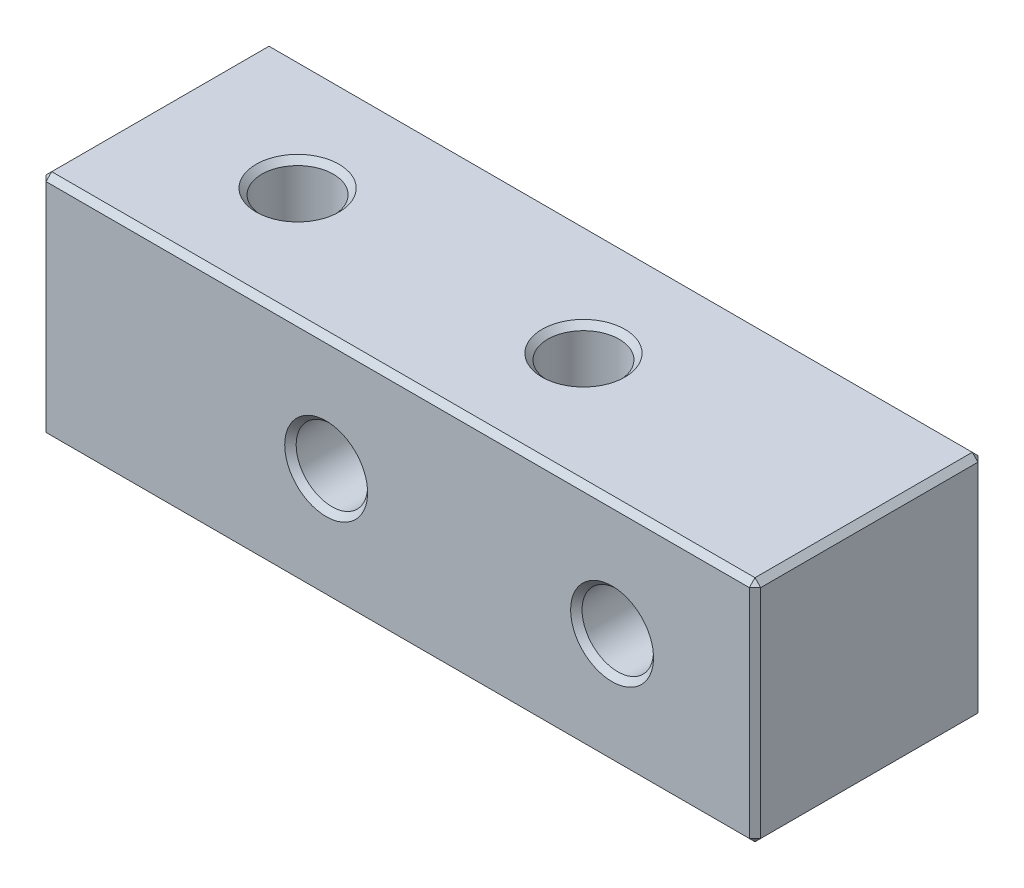
ISO-10303-21;
HEADER;
FILE_DESCRIPTION(('STEP AP214'),'2;1');
FILE_NAME('part.step','',(''),(''),'','','');
FILE_SCHEMA(('AUTOMOTIVE_DESIGN { 1 0 10303 214 1 1 1 1 }'));
ENDSEC;
DATA;
#1=APPLICATION_CONTEXT('core data for automotive mechanical design processes');
#2=APPLICATION_PROTOCOL_DEFINITION('international standard','automotive_design',2000,#1);
#3=PRODUCT_CONTEXT('',#1,'mechanical');
#4=PRODUCT('Part','Part','',(#3));
#5=PRODUCT_RELATED_PRODUCT_CATEGORY('part','',(#4));
#6=PRODUCT_DEFINITION_FORMATION('','',#4);
#7=PRODUCT_DEFINITION_CONTEXT('part definition',#1,'design');
#8=PRODUCT_DEFINITION('design','',#6,#7);
#9=PRODUCT_DEFINITION_SHAPE('','',#8);
#10=(LENGTH_UNIT() NAMED_UNIT(*) SI_UNIT(.MILLI.,.METRE.));
#11=(NAMED_UNIT(*) PLANE_ANGLE_UNIT() SI_UNIT($,.RADIAN.));
#12=(NAMED_UNIT(*) SI_UNIT($,.STERADIAN.) SOLID_ANGLE_UNIT());
#13=UNCERTAINTY_MEASURE_WITH_UNIT(LENGTH_MEASURE(1.E-05),#10,'distance_accuracy_value','');
#14=(GEOMETRIC_REPRESENTATION_CONTEXT(3) GLOBAL_UNCERTAINTY_ASSIGNED_CONTEXT((#13)) GLOBAL_UNIT_ASSIGNED_CONTEXT((#10,
#11,#12)) REPRESENTATION_CONTEXT('',''));
#15=CARTESIAN_POINT('',(0.,0.,0.));
#16=DIRECTION('',(0.,0.,1.));
#17=DIRECTION('',(1.,0.,0.));
#18=AXIS2_PLACEMENT_3D('',#15,#16,#17);
#19=CARTESIAN_POINT('',(12.5,4.,-4.));
#20=DIRECTION('',(-1.,0.,0.));
#21=DIRECTION('',(0.,0.,1.));
#22=AXIS2_PLACEMENT_3D('',#19,#20,#21);
#23=PLANE('',#22);
#24=DIRECTION('',(0.,-1.,0.));
#25=VECTOR('',#24,1.);
#26=CARTESIAN_POINT('',(12.5,4.,3.8));
#27=LINE('',#26,#25);
#28=CARTESIAN_POINT('',(12.5,3.8,3.8));
#29=VERTEX_POINT('',#28);
#30=CARTESIAN_POINT('',(12.5,-3.8,3.8));
#31=VERTEX_POINT('',#30);
#32=EDGE_CURVE('E241',#29,#31,#27,.T.);
#33=ORIENTED_EDGE('',*,*,#32,.T.);
#34=DIRECTION('',(0.,0.,-1.));
#35=VECTOR('',#34,1.);
#36=CARTESIAN_POINT('',(12.5,-3.8,-4.));
#37=LINE('',#36,#35);
#38=CARTESIAN_POINT('',(12.5,-3.8,-3.8));
#39=VERTEX_POINT('',#38);
#40=EDGE_CURVE('E243',#31,#39,#37,.T.);
#41=ORIENTED_EDGE('',*,*,#40,.T.);
#42=DIRECTION('',(0.,1.,0.));
#43=VECTOR('',#42,1.);
#44=CARTESIAN_POINT('',(12.5,4.,-3.8));
#45=LINE('',#44,#43);
#46=CARTESIAN_POINT('',(12.5,3.8,-3.8));
#47=VERTEX_POINT('',#46);
#48=EDGE_CURVE('E237',#39,#47,#45,.T.);
#49=ORIENTED_EDGE('',*,*,#48,.T.);
#50=DIRECTION('',(0.,0.,1.));
#51=VECTOR('',#50,1.);
#52=CARTESIAN_POINT('',(12.5,3.8,4.));
#53=LINE('',#52,#51);
#54=EDGE_CURVE('E239',#47,#29,#53,.T.);
#55=ORIENTED_EDGE('',*,*,#54,.T.);
#56=EDGE_LOOP('',(#33,#41,#49,#55));
#57=FACE_BOUND('',#56,.T.);
#58=ADVANCED_FACE('F41',(#57),#23,.F.);
#59=CARTESIAN_POINT('',(-12.5,4.,-4.));
#60=DIRECTION('',(0.,0.,1.));
#61=DIRECTION('',(1.,0.,0.));
#62=AXIS2_PLACEMENT_3D('',#59,#60,#61);
#63=PLANE('',#62);
#64=DIRECTION('',(1.,0.,0.));
#65=VECTOR('',#64,1.);
#66=CARTESIAN_POINT('',(12.5,3.8,-4.));
#67=LINE('',#66,#65);
#68=CARTESIAN_POINT('',(-12.3,3.8,-4.));
#69=VERTEX_POINT('',#68);
#70=CARTESIAN_POINT('',(12.3,3.8,-4.));
#71=VERTEX_POINT('',#70);
#72=EDGE_CURVE('E51',#69,#71,#67,.T.);
#73=ORIENTED_EDGE('',*,*,#72,.T.);
#74=DIRECTION('',(0.,-1.,0.));
#75=VECTOR('',#74,1.);
#76=CARTESIAN_POINT('',(12.3,4.,-4.));
#77=LINE('',#76,#75);
#78=CARTESIAN_POINT('',(12.3,-3.8,-4.));
#79=VERTEX_POINT('',#78);
#80=EDGE_CURVE('E11',#71,#79,#77,.T.);
#81=ORIENTED_EDGE('',*,*,#80,.T.);
#82=DIRECTION('',(-1.,0.,0.));
#83=VECTOR('',#82,1.);
#84=CARTESIAN_POINT('',(-12.5,-3.8,-4.));
#85=LINE('',#84,#83);
#86=CARTESIAN_POINT('',(-12.3,-3.8,-4.));
#87=VERTEX_POINT('',#86);
#88=EDGE_CURVE('E252',#79,#87,#85,.T.);
#89=ORIENTED_EDGE('',*,*,#88,.T.);
#90=DIRECTION('',(0.,1.,0.));
#91=VECTOR('',#90,1.);
#92=CARTESIAN_POINT('',(-12.3,4.,-4.));
#93=LINE('',#92,#91);
#94=EDGE_CURVE('E62',#87,#69,#93,.T.);
#95=ORIENTED_EDGE('',*,*,#94,.T.);
#96=EDGE_LOOP('',(#73,#81,#89,#95));
#97=FACE_BOUND('',#96,.T.);
#98=CARTESIAN_POINT('',(-2.5,0.,-4.));
#99=DIRECTION('',(0.,0.,1.));
#100=DIRECTION('',(1.,0.,0.));
#101=AXIS2_PLACEMENT_3D('',#98,#99,#100);
#102=CIRCLE('',#101,1.44999999999999);
#103=CARTESIAN_POINT('',(-1.05000000000001,0.,-4.));
#104=VERTEX_POINT('',#103);
#105=EDGE_CURVE('E249',#104,#104,#102,.T.);
#106=ORIENTED_EDGE('',*,*,#105,.T.);
#107=EDGE_LOOP('',(#106));
#108=FACE_BOUND('',#107,.T.);
#109=CARTESIAN_POINT('',(7.5,0.,-4.));
#110=DIRECTION('',(0.,0.,1.));
#111=DIRECTION('',(1.,0.,0.));
#112=AXIS2_PLACEMENT_3D('',#109,#110,#111);
#113=CIRCLE('',#112,1.44999999999998);
#114=CARTESIAN_POINT('',(8.94999999999998,0.,-4.));
#115=VERTEX_POINT('',#114);
#116=EDGE_CURVE('E246',#115,#115,#113,.T.);
#117=ORIENTED_EDGE('',*,*,#116,.T.);
#118=EDGE_LOOP('',(#117));
#119=FACE_BOUND('',#118,.T.);
#120=ADVANCED_FACE('F324',(#97,#108,#119),#63,.F.);
#121=CARTESIAN_POINT('',(-12.5,4.,-4.));
#122=DIRECTION('',(1.,0.,0.));
#123=DIRECTION('',(0.,0.,-1.));
#124=AXIS2_PLACEMENT_3D('',#121,#122,#123);
#125=PLANE('',#124);
#126=DIRECTION('',(0.,-1.,0.));
#127=VECTOR('',#126,1.);
#128=CARTESIAN_POINT('',(-12.5,4.,-3.8));
#129=LINE('',#128,#127);
#130=CARTESIAN_POINT('',(-12.5,3.8,-3.8));
#131=VERTEX_POINT('',#130);
#132=CARTESIAN_POINT('',(-12.5,-3.8,-3.8));
#133=VERTEX_POINT('',#132);
#134=EDGE_CURVE('E230',#131,#133,#129,.T.);
#135=ORIENTED_EDGE('',*,*,#134,.T.);
#136=DIRECTION('',(0.,0.,1.));
#137=VECTOR('',#136,1.);
#138=CARTESIAN_POINT('',(-12.5,-3.8,-4.));
#139=LINE('',#138,#137);
#140=CARTESIAN_POINT('',(-12.5,-3.8,3.8));
#141=VERTEX_POINT('',#140);
#142=EDGE_CURVE('E138',#133,#141,#139,.T.);
#143=ORIENTED_EDGE('',*,*,#142,.T.);
#144=DIRECTION('',(0.,1.,0.));
#145=VECTOR('',#144,1.);
#146=CARTESIAN_POINT('',(-12.5,4.,3.8));
#147=LINE('',#146,#145);
#148=CARTESIAN_POINT('',(-12.5,3.8,3.8));
#149=VERTEX_POINT('',#148);
#150=EDGE_CURVE('E234',#141,#149,#147,.T.);
#151=ORIENTED_EDGE('',*,*,#150,.T.);
#152=DIRECTION('',(0.,0.,-1.));
#153=VECTOR('',#152,1.);
#154=CARTESIAN_POINT('',(-12.5,3.8,-4.));
#155=LINE('',#154,#153);
#156=EDGE_CURVE('E232',#149,#131,#155,.T.);
#157=ORIENTED_EDGE('',*,*,#156,.T.);
#158=EDGE_LOOP('',(#135,#143,#151,#157));
#159=FACE_BOUND('',#158,.T.);
#160=ADVANCED_FACE('F381',(#159),#125,.F.);
#161=CARTESIAN_POINT('',(-12.5,4.,4.));
#162=DIRECTION('',(0.,0.,-1.));
#163=DIRECTION('',(-1.,0.,0.));
#164=AXIS2_PLACEMENT_3D('',#161,#162,#163);
#165=PLANE('',#164);
#166=CARTESIAN_POINT('',(-2.5,0.,4.));
#167=DIRECTION('',(0.,0.,-1.));
#168=DIRECTION('',(-1.,0.,0.));
#169=AXIS2_PLACEMENT_3D('',#166,#167,#168);
#170=CIRCLE('',#169,1.45);
#171=CARTESIAN_POINT('',(-3.95,0.,4.));
#172=VERTEX_POINT('',#171);
#173=EDGE_CURVE('E200',#172,#172,#170,.T.);
#174=ORIENTED_EDGE('',*,*,#173,.T.);
#175=EDGE_LOOP('',(#174));
#176=FACE_BOUND('',#175,.T.);
#177=CARTESIAN_POINT('',(7.5,0.,4.));
#178=DIRECTION('',(0.,0.,-1.));
#179=DIRECTION('',(-1.,0.,0.));
#180=AXIS2_PLACEMENT_3D('',#177,#178,#179);
#181=CIRCLE('',#180,1.45);
#182=CARTESIAN_POINT('',(6.05,0.,4.));
#183=VERTEX_POINT('',#182);
#184=EDGE_CURVE('E197',#183,#183,#181,.T.);
#185=ORIENTED_EDGE('',*,*,#184,.T.);
#186=EDGE_LOOP('',(#185));
#187=FACE_BOUND('',#186,.T.);
#188=DIRECTION('',(-1.,0.,0.));
#189=VECTOR('',#188,1.);
#190=CARTESIAN_POINT('',(-12.5,3.8,4.));
#191=LINE('',#190,#189);
#192=CARTESIAN_POINT('',(12.3,3.8,4.));
#193=VERTEX_POINT('',#192);
#194=CARTESIAN_POINT('',(-12.3,3.8,4.));
#195=VERTEX_POINT('',#194);
#196=EDGE_CURVE('E188',#193,#195,#191,.T.);
#197=ORIENTED_EDGE('',*,*,#196,.T.);
#198=DIRECTION('',(0.,-1.,0.));
#199=VECTOR('',#198,1.);
#200=CARTESIAN_POINT('',(-12.3,4.,4.));
#201=LINE('',#200,#199);
#202=CARTESIAN_POINT('',(-12.3,-3.8,4.));
#203=VERTEX_POINT('',#202);
#204=EDGE_CURVE('E194',#195,#203,#201,.T.);
#205=ORIENTED_EDGE('',*,*,#204,.T.);
#206=DIRECTION('',(1.,0.,0.));
#207=VECTOR('',#206,1.);
#208=CARTESIAN_POINT('',(-12.5,-3.8,4.));
#209=LINE('',#208,#207);
#210=CARTESIAN_POINT('',(12.3,-3.8,4.));
#211=VERTEX_POINT('',#210);
#212=EDGE_CURVE('E192',#203,#211,#209,.T.);
#213=ORIENTED_EDGE('',*,*,#212,.T.);
#214=DIRECTION('',(0.,1.,0.));
#215=VECTOR('',#214,1.);
#216=CARTESIAN_POINT('',(12.3,4.,4.));
#217=LINE('',#216,#215);
#218=EDGE_CURVE('E190',#211,#193,#217,.T.);
#219=ORIENTED_EDGE('',*,*,#218,.T.);
#220=EDGE_LOOP('',(#197,#205,#213,#219));
#221=FACE_BOUND('',#220,.T.);
#222=ADVANCED_FACE('F556',(#176,#187,#221),#165,.F.);
#223=CARTESIAN_POINT('',(0.,4.,0.));
#224=DIRECTION('',(0.,1.,0.));
#225=DIRECTION('',(0.,0.,1.));
#226=AXIS2_PLACEMENT_3D('',#223,#224,#225);
#227=PLANE('',#226);
#228=CARTESIAN_POINT('',(2.5,4.,0.));
#229=DIRECTION('',(0.,1.,0.));
#230=DIRECTION('',(0.,0.,1.));
#231=AXIS2_PLACEMENT_3D('',#228,#229,#230);
#232=CIRCLE('',#231,1.44999999999998);
#233=CARTESIAN_POINT('',(2.5,4.,1.44999999999998));
#234=VERTEX_POINT('',#233);
#235=EDGE_CURVE('E227',#234,#234,#232,.F.);
#236=ORIENTED_EDGE('',*,*,#235,.T.);
#237=EDGE_LOOP('',(#236));
#238=FACE_BOUND('',#237,.T.);
#239=CARTESIAN_POINT('',(-7.5,4.,0.));
#240=DIRECTION('',(0.,1.,0.));
#241=DIRECTION('',(0.,0.,1.));
#242=AXIS2_PLACEMENT_3D('',#239,#240,#241);
#243=CIRCLE('',#242,1.44999999999998);
#244=CARTESIAN_POINT('',(-7.5,4.,1.44999999999998));
#245=VERTEX_POINT('',#244);
#246=EDGE_CURVE('E224',#245,#245,#243,.F.);
#247=ORIENTED_EDGE('',*,*,#246,.T.);
#248=EDGE_LOOP('',(#247));
#249=FACE_BOUND('',#248,.T.);
#250=DIRECTION('',(0.,0.,1.));
#251=VECTOR('',#250,1.);
#252=CARTESIAN_POINT('',(-12.3,4.,4.));
#253=LINE('',#252,#251);
#254=CARTESIAN_POINT('',(-12.3,4.,-3.8));
#255=VERTEX_POINT('',#254);
#256=CARTESIAN_POINT('',(-12.3,4.,3.8));
#257=VERTEX_POINT('',#256);
#258=EDGE_CURVE('E219',#255,#257,#253,.T.);
#259=ORIENTED_EDGE('',*,*,#258,.T.);
#260=DIRECTION('',(1.,0.,0.));
#261=VECTOR('',#260,1.);
#262=CARTESIAN_POINT('',(12.5,4.,3.8));
#263=LINE('',#262,#261);
#264=CARTESIAN_POINT('',(12.3,4.,3.8));
#265=VERTEX_POINT('',#264);
#266=EDGE_CURVE('E221',#257,#265,#263,.T.);
#267=ORIENTED_EDGE('',*,*,#266,.T.);
#268=DIRECTION('',(0.,0.,-1.));
#269=VECTOR('',#268,1.);
#270=CARTESIAN_POINT('',(12.3,4.,-4.));
#271=LINE('',#270,#269);
#272=CARTESIAN_POINT('',(12.3,4.,-3.8));
#273=VERTEX_POINT('',#272);
#274=EDGE_CURVE('E217',#265,#273,#271,.T.);
#275=ORIENTED_EDGE('',*,*,#274,.T.);
#276=DIRECTION('',(-1.,0.,0.));
#277=VECTOR('',#276,1.);
#278=CARTESIAN_POINT('',(-12.5,4.,-3.8));
#279=LINE('',#278,#277);
#280=EDGE_CURVE('E215',#273,#255,#279,.T.);
#281=ORIENTED_EDGE('',*,*,#280,.T.);
#282=EDGE_LOOP('',(#259,#267,#275,#281));
#283=FACE_BOUND('',#282,.T.);
#284=ADVANCED_FACE('F338',(#238,#249,#283),#227,.T.);
#285=CARTESIAN_POINT('',(0.,-4.,0.));
#286=DIRECTION('',(0.,1.,0.));
#287=DIRECTION('',(0.,0.,1.));
#288=AXIS2_PLACEMENT_3D('',#285,#286,#287);
#289=PLANE('',#288);
#290=CARTESIAN_POINT('',(2.5,-4.,0.));
#291=DIRECTION('',(0.,1.,0.));
#292=DIRECTION('',(0.,0.,1.));
#293=AXIS2_PLACEMENT_3D('',#290,#291,#292);
#294=CIRCLE('',#293,1.45);
#295=CARTESIAN_POINT('',(2.5,-4.,1.45));
#296=VERTEX_POINT('',#295);
#297=EDGE_CURVE('E173',#296,#296,#294,.T.);
#298=ORIENTED_EDGE('',*,*,#297,.T.);
#299=EDGE_LOOP('',(#298));
#300=FACE_BOUND('',#299,.T.);
#301=CARTESIAN_POINT('',(-7.5,-4.,0.));
#302=DIRECTION('',(0.,1.,0.));
#303=DIRECTION('',(0.,0.,1.));
#304=AXIS2_PLACEMENT_3D('',#301,#302,#303);
#305=CIRCLE('',#304,1.45);
#306=CARTESIAN_POINT('',(-7.5,-4.,1.45));
#307=VERTEX_POINT('',#306);
#308=EDGE_CURVE('E167',#307,#307,#305,.T.);
#309=ORIENTED_EDGE('',*,*,#308,.T.);
#310=EDGE_LOOP('',(#309));
#311=FACE_BOUND('',#310,.T.);
#312=DIRECTION('',(0.,0.,1.));
#313=VECTOR('',#312,1.);
#314=CARTESIAN_POINT('',(12.3,-4.,0.));
#315=LINE('',#314,#313);
#316=CARTESIAN_POINT('',(12.3,-4.,-3.8));
#317=VERTEX_POINT('',#316);
#318=CARTESIAN_POINT('',(12.3,-4.,3.8));
#319=VERTEX_POINT('',#318);
#320=EDGE_CURVE('E160',#317,#319,#315,.T.);
#321=ORIENTED_EDGE('',*,*,#320,.T.);
#322=DIRECTION('',(-1.,0.,0.));
#323=VECTOR('',#322,1.);
#324=CARTESIAN_POINT('',(0.,-4.,3.8));
#325=LINE('',#324,#323);
#326=CARTESIAN_POINT('',(-12.3,-4.,3.8));
#327=VERTEX_POINT('',#326);
#328=EDGE_CURVE('E164',#319,#327,#325,.T.);
#329=ORIENTED_EDGE('',*,*,#328,.T.);
#330=DIRECTION('',(0.,0.,-1.));
#331=VECTOR('',#330,1.);
#332=CARTESIAN_POINT('',(-12.3,-4.,0.));
#333=LINE('',#332,#331);
#334=CARTESIAN_POINT('',(-12.3,-4.,-3.8));
#335=VERTEX_POINT('',#334);
#336=EDGE_CURVE('E135',#327,#335,#333,.T.);
#337=ORIENTED_EDGE('',*,*,#336,.T.);
#338=DIRECTION('',(1.,0.,0.));
#339=VECTOR('',#338,1.);
#340=CARTESIAN_POINT('',(0.,-4.,-3.8));
#341=LINE('',#340,#339);
#342=EDGE_CURVE('E154',#335,#317,#341,.T.);
#343=ORIENTED_EDGE('',*,*,#342,.T.);
#344=EDGE_LOOP('',(#321,#329,#337,#343));
#345=FACE_BOUND('',#344,.T.);
#346=ADVANCED_FACE('F162',(#300,#311,#345),#289,.F.);
#347=CARTESIAN_POINT('',(2.5,4.,0.));
#348=DIRECTION('',(0.,1.,0.));
#349=DIRECTION('',(0.,0.,1.));
#350=AXIS2_PLACEMENT_3D('',#347,#348,#349);
#351=CYLINDRICAL_SURFACE('',#350,1.24999999999999);
#352=CARTESIAN_POINT('',(2.5,-3.79999999999999,0.));
#353=DIRECTION('',(0.,1.,0.));
#354=DIRECTION('',(0.,0.,1.));
#355=AXIS2_PLACEMENT_3D('',#352,#353,#354);
#356=CIRCLE('',#355,1.24999999999999);
#357=CARTESIAN_POINT('',(2.5,-3.79999999999999,1.24999999999999));
#358=VERTEX_POINT('',#357);
#359=EDGE_CURVE('E179',#358,#358,#356,.F.);
#360=ORIENTED_EDGE('',*,*,#359,.T.);
#361=EDGE_LOOP('',(#360));
#362=FACE_BOUND('',#361,.T.);
#363=CARTESIAN_POINT('',(2.5,3.80000000000001,0.));
#364=DIRECTION('',(0.,1.,0.));
#365=DIRECTION('',(0.,0.,1.));
#366=AXIS2_PLACEMENT_3D('',#363,#364,#365);
#367=CIRCLE('',#366,1.24999999999999);
#368=CARTESIAN_POINT('',(2.5,3.80000000000001,1.24999999999999));
#369=VERTEX_POINT('',#368);
#370=EDGE_CURVE('E176',#369,#369,#367,.T.);
#371=ORIENTED_EDGE('',*,*,#370,.T.);
#372=EDGE_LOOP('',(#371));
#373=FACE_BOUND('',#372,.T.);
#374=ADVANCED_FACE('F547',(#362,#373),#351,.F.);
#375=CARTESIAN_POINT('',(-7.5,4.,0.));
#376=DIRECTION('',(0.,1.,0.));
#377=DIRECTION('',(0.,0.,1.));
#378=AXIS2_PLACEMENT_3D('',#375,#376,#377);
#379=CYLINDRICAL_SURFACE('',#378,1.24999999999999);
#380=CARTESIAN_POINT('',(-7.5,-3.79999999999999,0.));
#381=DIRECTION('',(0.,1.,0.));
#382=DIRECTION('',(0.,0.,1.));
#383=AXIS2_PLACEMENT_3D('',#380,#381,#382);
#384=CIRCLE('',#383,1.24999999999999);
#385=CARTESIAN_POINT('',(-7.5,-3.79999999999999,1.24999999999999));
#386=VERTEX_POINT('',#385);
#387=EDGE_CURVE('E185',#386,#386,#384,.F.);
#388=ORIENTED_EDGE('',*,*,#387,.T.);
#389=EDGE_LOOP('',(#388));
#390=FACE_BOUND('',#389,.T.);
#391=CARTESIAN_POINT('',(-7.5,3.80000000000001,0.));
#392=DIRECTION('',(0.,1.,0.));
#393=DIRECTION('',(0.,0.,1.));
#394=AXIS2_PLACEMENT_3D('',#391,#392,#393);
#395=CIRCLE('',#394,1.24999999999999);
#396=CARTESIAN_POINT('',(-7.5,3.80000000000001,1.24999999999999));
#397=VERTEX_POINT('',#396);
#398=EDGE_CURVE('E182',#397,#397,#395,.T.);
#399=ORIENTED_EDGE('',*,*,#398,.T.);
#400=EDGE_LOOP('',(#399));
#401=FACE_BOUND('',#400,.T.);
#402=ADVANCED_FACE('F538',(#390,#401),#379,.F.);
#403=CARTESIAN_POINT('',(-2.5,0.,-4.));
#404=DIRECTION('',(0.,0.,-1.));
#405=DIRECTION('',(-1.,0.,0.));
#406=AXIS2_PLACEMENT_3D('',#403,#404,#405);
#407=CYLINDRICAL_SURFACE('',#406,1.24999999999999);
#408=CARTESIAN_POINT('',(-2.5,0.,3.79999999999999));
#409=DIRECTION('',(0.,0.,-1.));
#410=DIRECTION('',(-1.,0.,0.));
#411=AXIS2_PLACEMENT_3D('',#408,#409,#410);
#412=CIRCLE('',#411,1.24999999999999);
#413=CARTESIAN_POINT('',(-3.74999999999999,0.,3.79999999999999));
#414=VERTEX_POINT('',#413);
#415=EDGE_CURVE('E206',#414,#414,#412,.F.);
#416=ORIENTED_EDGE('',*,*,#415,.T.);
#417=EDGE_LOOP('',(#416));
#418=FACE_BOUND('',#417,.T.);
#419=CARTESIAN_POINT('',(-2.5,0.,-3.8));
#420=DIRECTION('',(0.,0.,1.));
#421=DIRECTION('',(1.,0.,0.));
#422=AXIS2_PLACEMENT_3D('',#419,#420,#421);
#423=CIRCLE('',#422,1.24999999999999);
#424=CARTESIAN_POINT('',(-1.25000000000001,0.,-3.8));
#425=VERTEX_POINT('',#424);
#426=EDGE_CURVE('E203',#425,#425,#423,.F.);
#427=ORIENTED_EDGE('',*,*,#426,.T.);
#428=EDGE_LOOP('',(#427));
#429=FACE_BOUND('',#428,.T.);
#430=ADVANCED_FACE('F536',(#418,#429),#407,.F.);
#431=CARTESIAN_POINT('',(7.5,0.,-4.));
#432=DIRECTION('',(0.,0.,-1.));
#433=DIRECTION('',(-1.,0.,0.));
#434=AXIS2_PLACEMENT_3D('',#431,#432,#433);
#435=CYLINDRICAL_SURFACE('',#434,1.24999999999999);
#436=CARTESIAN_POINT('',(7.5,0.,3.79999999999999));
#437=DIRECTION('',(0.,0.,-1.));
#438=DIRECTION('',(-1.,0.,0.));
#439=AXIS2_PLACEMENT_3D('',#436,#437,#438);
#440=CIRCLE('',#439,1.24999999999999);
#441=CARTESIAN_POINT('',(6.25000000000001,0.,3.79999999999999));
#442=VERTEX_POINT('',#441);
#443=EDGE_CURVE('E212',#442,#442,#440,.F.);
#444=ORIENTED_EDGE('',*,*,#443,.T.);
#445=EDGE_LOOP('',(#444));
#446=FACE_BOUND('',#445,.T.);
#447=CARTESIAN_POINT('',(7.5,0.,-3.80000000000001));
#448=DIRECTION('',(0.,0.,1.));
#449=DIRECTION('',(1.,0.,0.));
#450=AXIS2_PLACEMENT_3D('',#447,#448,#449);
#451=CIRCLE('',#450,1.24999999999999);
#452=CARTESIAN_POINT('',(8.74999999999999,0.,-3.80000000000001));
#453=VERTEX_POINT('',#452);
#454=EDGE_CURVE('E209',#453,#453,#451,.F.);
#455=ORIENTED_EDGE('',*,*,#454,.T.);
#456=EDGE_LOOP('',(#455));
#457=FACE_BOUND('',#456,.T.);
#458=ADVANCED_FACE('F393',(#446,#457),#435,.F.);
#459=CARTESIAN_POINT('',(2.5,-4.,0.));
#460=DIRECTION('',(0.,-1.,0.));
#461=DIRECTION('',(0.,0.,-1.));
#462=AXIS2_PLACEMENT_3D('',#459,#460,#461);
#463=CONICAL_SURFACE('',#462,1.45,0.78539816339744);
#464=ORIENTED_EDGE('',*,*,#359,.F.);
#465=EDGE_LOOP('',(#464));
#466=FACE_BOUND('',#465,.T.);
#467=ORIENTED_EDGE('',*,*,#297,.F.);
#468=EDGE_LOOP('',(#467));
#469=FACE_BOUND('',#468,.T.);
#470=ADVANCED_FACE('F386',(#466,#469),#463,.F.);
#471=CARTESIAN_POINT('',(-7.5,-4.,0.));
#472=DIRECTION('',(0.,-1.,0.));
#473=DIRECTION('',(0.,0.,-1.));
#474=AXIS2_PLACEMENT_3D('',#471,#472,#473);
#475=CONICAL_SURFACE('',#474,1.45,0.78539816339744);
#476=ORIENTED_EDGE('',*,*,#387,.F.);
#477=EDGE_LOOP('',(#476));
#478=FACE_BOUND('',#477,.T.);
#479=ORIENTED_EDGE('',*,*,#308,.F.);
#480=EDGE_LOOP('',(#479));
#481=FACE_BOUND('',#480,.T.);
#482=ADVANCED_FACE('F392',(#478,#481),#475,.F.);
#483=CARTESIAN_POINT('',(-2.5,0.,4.));
#484=DIRECTION('',(0.,0.,1.));
#485=DIRECTION('',(1.,0.,0.));
#486=AXIS2_PLACEMENT_3D('',#483,#484,#485);
#487=CONICAL_SURFACE('',#486,1.45,0.78539816339744);
#488=ORIENTED_EDGE('',*,*,#415,.F.);
#489=EDGE_LOOP('',(#488));
#490=FACE_BOUND('',#489,.T.);
#491=ORIENTED_EDGE('',*,*,#173,.F.);
#492=EDGE_LOOP('',(#491));
#493=FACE_BOUND('',#492,.T.);
#494=ADVANCED_FACE('F400',(#490,#493),#487,.F.);
#495=CARTESIAN_POINT('',(7.5,0.,4.));
#496=DIRECTION('',(0.,0.,1.));
#497=DIRECTION('',(1.,0.,0.));
#498=AXIS2_PLACEMENT_3D('',#495,#496,#497);
#499=CONICAL_SURFACE('',#498,1.45,0.785398163397444);
#500=ORIENTED_EDGE('',*,*,#443,.F.);
#501=EDGE_LOOP('',(#500));
#502=FACE_BOUND('',#501,.T.);
#503=ORIENTED_EDGE('',*,*,#184,.F.);
#504=EDGE_LOOP('',(#503));
#505=FACE_BOUND('',#504,.T.);
#506=ADVANCED_FACE('F407',(#502,#505),#499,.F.);
#507=CARTESIAN_POINT('',(2.5,3.80000000000001,0.));
#508=DIRECTION('',(0.,1.,0.));
#509=DIRECTION('',(0.,0.,1.));
#510=AXIS2_PLACEMENT_3D('',#507,#508,#509);
#511=CONICAL_SURFACE('',#510,1.24999999999999,0.785398163397448);
#512=ORIENTED_EDGE('',*,*,#235,.F.);
#513=EDGE_LOOP('',(#512));
#514=FACE_BOUND('',#513,.T.);
#515=ORIENTED_EDGE('',*,*,#370,.F.);
#516=EDGE_LOOP('',(#515));
#517=FACE_BOUND('',#516,.T.);
#518=ADVANCED_FACE('F414',(#514,#517),#511,.F.);
#519=CARTESIAN_POINT('',(-7.5,3.80000000000001,0.));
#520=DIRECTION('',(0.,1.,0.));
#521=DIRECTION('',(0.,0.,1.));
#522=AXIS2_PLACEMENT_3D('',#519,#520,#521);
#523=CONICAL_SURFACE('',#522,1.24999999999999,0.785398163397448);
#524=ORIENTED_EDGE('',*,*,#246,.F.);
#525=EDGE_LOOP('',(#524));
#526=FACE_BOUND('',#525,.T.);
#527=ORIENTED_EDGE('',*,*,#398,.F.);
#528=EDGE_LOOP('',(#527));
#529=FACE_BOUND('',#528,.T.);
#530=ADVANCED_FACE('F421',(#526,#529),#523,.F.);
#531=CARTESIAN_POINT('',(12.3,4.,0.));
#532=DIRECTION('',(0.707106781186548,0.707106781186548,0.));
#533=DIRECTION('',(0.,0.,1.));
#534=AXIS2_PLACEMENT_3D('',#531,#532,#533);
#535=PLANE('',#534);
#536=DIRECTION('',(0.707106781186547,-0.707106781186547,0.));
#537=VECTOR('',#536,1.);
#538=CARTESIAN_POINT('',(12.3,4.,-3.8));
#539=LINE('',#538,#537);
#540=EDGE_CURVE('E46',#273,#47,#539,.T.);
#541=ORIENTED_EDGE('',*,*,#540,.F.);
#542=ORIENTED_EDGE('',*,*,#274,.F.);
#543=DIRECTION('',(-0.707106781186547,0.707106781186547,0.));
#544=VECTOR('',#543,1.);
#545=CARTESIAN_POINT('',(12.4,3.9,3.8));
#546=LINE('',#545,#544);
#547=EDGE_CURVE('E303',#29,#265,#546,.T.);
#548=ORIENTED_EDGE('',*,*,#547,.F.);
#549=ORIENTED_EDGE('',*,*,#54,.F.);
#550=EDGE_LOOP('',(#541,#542,#548,#549));
#551=FACE_BOUND('',#550,.T.);
#552=ADVANCED_FACE('F428',(#551),#535,.T.);
#553=CARTESIAN_POINT('',(12.3,4.,-3.8));
#554=DIRECTION('',(0.577350269189626,0.577350269189626,-0.577350269189626));
#555=DIRECTION('',(-0.707106781186548,0.,-0.707106781186548));
#556=AXIS2_PLACEMENT_3D('',#553,#554,#555);
#557=PLANE('',#556);
#558=DIRECTION('',(0.,0.707106781186547,0.707106781186547));
#559=VECTOR('',#558,1.);
#560=CARTESIAN_POINT('',(12.3,4.,-3.8));
#561=LINE('',#560,#559);
#562=EDGE_CURVE('E299',#273,#71,#561,.F.);
#563=ORIENTED_EDGE('',*,*,#562,.F.);
#564=ORIENTED_EDGE('',*,*,#540,.T.);
#565=DIRECTION('',(0.707106781186547,0.,0.707106781186547));
#566=VECTOR('',#565,1.);
#567=CARTESIAN_POINT('',(12.4,3.8,-3.9));
#568=LINE('',#567,#566);
#569=EDGE_CURVE('E301',#71,#47,#568,.T.);
#570=ORIENTED_EDGE('',*,*,#569,.F.);
#571=EDGE_LOOP('',(#563,#564,#570));
#572=FACE_BOUND('',#571,.T.);
#573=ADVANCED_FACE('F315',(#572),#557,.T.);
#574=CARTESIAN_POINT('',(12.3,3.8,4.));
#575=DIRECTION('',(0.577350269189626,0.577350269189626,0.577350269189626));
#576=DIRECTION('',(0.707106781186548,0.,-0.707106781186548));
#577=AXIS2_PLACEMENT_3D('',#574,#575,#576);
#578=PLANE('',#577);
#579=DIRECTION('',(-0.707106781186547,0.,0.707106781186547));
#580=VECTOR('',#579,1.);
#581=CARTESIAN_POINT('',(12.3,3.8,4.));
#582=LINE('',#581,#580);
#583=EDGE_CURVE('E294',#29,#193,#582,.T.);
#584=ORIENTED_EDGE('',*,*,#583,.F.);
#585=ORIENTED_EDGE('',*,*,#547,.T.);
#586=DIRECTION('',(0.,-0.707106781186547,0.707106781186547));
#587=VECTOR('',#586,1.);
#588=CARTESIAN_POINT('',(12.3,3.8,4.));
#589=LINE('',#588,#587);
#590=EDGE_CURVE('E297',#193,#265,#589,.F.);
#591=ORIENTED_EDGE('',*,*,#590,.F.);
#592=EDGE_LOOP('',(#584,#585,#591));
#593=FACE_BOUND('',#592,.T.);
#594=ADVANCED_FACE('F352',(#593),#578,.T.);
#595=CARTESIAN_POINT('',(12.3,4.,-4.));
#596=DIRECTION('',(-0.707106781186548,0.,0.707106781186548));
#597=DIRECTION('',(0.,-1.,0.));
#598=AXIS2_PLACEMENT_3D('',#595,#596,#597);
#599=PLANE('',#598);
#600=ORIENTED_EDGE('',*,*,#569,.T.);
#601=ORIENTED_EDGE('',*,*,#48,.F.);
#602=DIRECTION('',(-0.707106781186547,0.,-0.707106781186547));
#603=VECTOR('',#602,1.);
#604=CARTESIAN_POINT('',(12.5,-3.8,-3.8));
#605=LINE('',#604,#603);
#606=EDGE_CURVE('E289',#79,#39,#605,.F.);
#607=ORIENTED_EDGE('',*,*,#606,.F.);
#608=ORIENTED_EDGE('',*,*,#80,.F.);
#609=EDGE_LOOP('',(#600,#601,#607,#608));
#610=FACE_BOUND('',#609,.T.);
#611=ADVANCED_FACE('F322',(#610),#599,.F.);
#612=CARTESIAN_POINT('',(0.,4.,-3.8));
#613=DIRECTION('',(0.,0.707106781186548,-0.707106781186548));
#614=DIRECTION('',(1.,0.,0.));
#615=AXIS2_PLACEMENT_3D('',#612,#613,#614);
#616=PLANE('',#615);
#617=ORIENTED_EDGE('',*,*,#562,.T.);
#618=ORIENTED_EDGE('',*,*,#72,.F.);
#619=DIRECTION('',(0.,-0.707106781186547,-0.707106781186547));
#620=VECTOR('',#619,1.);
#621=CARTESIAN_POINT('',(-12.3,3.9,-3.9));
#622=LINE('',#621,#620);
#623=EDGE_CURVE('E286',#255,#69,#622,.T.);
#624=ORIENTED_EDGE('',*,*,#623,.F.);
#625=ORIENTED_EDGE('',*,*,#280,.F.);
#626=EDGE_LOOP('',(#617,#618,#624,#625));
#627=FACE_BOUND('',#626,.T.);
#628=ADVANCED_FACE('F335',(#627),#616,.T.);
#629=CARTESIAN_POINT('',(-12.3,4.,0.));
#630=DIRECTION('',(-0.707106781186548,0.707106781186548,0.));
#631=DIRECTION('',(0.,0.,-1.));
#632=AXIS2_PLACEMENT_3D('',#629,#630,#631);
#633=PLANE('',#632);
#634=DIRECTION('',(-0.707106781186547,-0.707106781186547,0.));
#635=VECTOR('',#634,1.);
#636=CARTESIAN_POINT('',(-12.5,3.8,3.8));
#637=LINE('',#636,#635);
#638=EDGE_CURVE('E280',#257,#149,#637,.T.);
#639=ORIENTED_EDGE('',*,*,#638,.F.);
#640=ORIENTED_EDGE('',*,*,#258,.F.);
#641=DIRECTION('',(0.707106781186547,0.707106781186547,0.));
#642=VECTOR('',#641,1.);
#643=CARTESIAN_POINT('',(-12.5,3.8,-3.8));
#644=LINE('',#643,#642);
#645=EDGE_CURVE('E283',#131,#255,#644,.T.);
#646=ORIENTED_EDGE('',*,*,#645,.F.);
#647=ORIENTED_EDGE('',*,*,#156,.F.);
#648=EDGE_LOOP('',(#639,#640,#646,#647));
#649=FACE_BOUND('',#648,.T.);
#650=ADVANCED_FACE('F342',(#649),#633,.T.);
#651=CARTESIAN_POINT('',(0.,4.,3.8));
#652=DIRECTION('',(0.,0.707106781186548,0.707106781186548));
#653=DIRECTION('',(-1.,0.,0.));
#654=AXIS2_PLACEMENT_3D('',#651,#652,#653);
#655=PLANE('',#654);
#656=ORIENTED_EDGE('',*,*,#590,.T.);
#657=ORIENTED_EDGE('',*,*,#266,.F.);
#658=DIRECTION('',(0.,0.707106781186547,-0.707106781186547));
#659=VECTOR('',#658,1.);
#660=CARTESIAN_POINT('',(-12.3,3.9,3.9));
#661=LINE('',#660,#659);
#662=EDGE_CURVE('E277',#195,#257,#661,.T.);
#663=ORIENTED_EDGE('',*,*,#662,.F.);
#664=ORIENTED_EDGE('',*,*,#196,.F.);
#665=EDGE_LOOP('',(#656,#657,#663,#664));
#666=FACE_BOUND('',#665,.T.);
#667=ADVANCED_FACE('F351',(#666),#655,.T.);
#668=CARTESIAN_POINT('',(12.5,4.,3.8));
#669=DIRECTION('',(-0.707106781186548,0.,-0.707106781186548));
#670=DIRECTION('',(0.,-1.,0.));
#671=AXIS2_PLACEMENT_3D('',#668,#669,#670);
#672=PLANE('',#671);
#673=ORIENTED_EDGE('',*,*,#583,.T.);
#674=ORIENTED_EDGE('',*,*,#218,.F.);
#675=DIRECTION('',(0.707106781186547,0.,-0.707106781186547));
#676=VECTOR('',#675,1.);
#677=CARTESIAN_POINT('',(12.4,-3.8,3.9));
#678=LINE('',#677,#676);
#679=EDGE_CURVE('E274',#31,#211,#678,.F.);
#680=ORIENTED_EDGE('',*,*,#679,.F.);
#681=ORIENTED_EDGE('',*,*,#32,.F.);
#682=EDGE_LOOP('',(#673,#674,#680,#681));
#683=FACE_BOUND('',#682,.T.);
#684=ADVANCED_FACE('F357',(#683),#672,.F.);
#685=CARTESIAN_POINT('',(12.5,-3.8,-4.));
#686=DIRECTION('',(-0.707106781186548,0.707106781186548,0.));
#687=DIRECTION('',(0.,0.,-1.));
#688=AXIS2_PLACEMENT_3D('',#685,#686,#687);
#689=PLANE('',#688);
#690=DIRECTION('',(0.707106781186547,0.707106781186547,0.));
#691=VECTOR('',#690,1.);
#692=CARTESIAN_POINT('',(12.5,-3.8,-3.8));
#693=LINE('',#692,#691);
#694=EDGE_CURVE('E291',#39,#317,#693,.F.);
#695=ORIENTED_EDGE('',*,*,#694,.F.);
#696=ORIENTED_EDGE('',*,*,#40,.F.);
#697=DIRECTION('',(-0.707106781186547,-0.707106781186547,0.));
#698=VECTOR('',#697,1.);
#699=CARTESIAN_POINT('',(12.3,-4.,3.8));
#700=LINE('',#699,#698);
#701=EDGE_CURVE('E271',#319,#31,#700,.F.);
#702=ORIENTED_EDGE('',*,*,#701,.F.);
#703=ORIENTED_EDGE('',*,*,#320,.F.);
#704=EDGE_LOOP('',(#695,#696,#702,#703));
#705=FACE_BOUND('',#704,.T.);
#706=ADVANCED_FACE('F363',(#705),#689,.F.);
#707=CARTESIAN_POINT('',(12.5,-3.8,-3.8));
#708=DIRECTION('',(0.577350269189626,-0.577350269189626,-0.577350269189626));
#709=DIRECTION('',(-0.707106781186548,0.,-0.707106781186548));
#710=AXIS2_PLACEMENT_3D('',#707,#708,#709);
#711=PLANE('',#710);
#712=ORIENTED_EDGE('',*,*,#606,.T.);
#713=ORIENTED_EDGE('',*,*,#694,.T.);
#714=DIRECTION('',(0.,-0.707106781186547,0.707106781186547));
#715=VECTOR('',#714,1.);
#716=CARTESIAN_POINT('',(12.3,-3.9,-3.9));
#717=LINE('',#716,#715);
#718=EDGE_CURVE('E157',#79,#317,#717,.T.);
#719=ORIENTED_EDGE('',*,*,#718,.F.);
#720=EDGE_LOOP('',(#712,#713,#719));
#721=FACE_BOUND('',#720,.T.);
#722=ADVANCED_FACE('F366',(#721),#711,.T.);
#723=CARTESIAN_POINT('',(-12.5,3.8,-3.8));
#724=DIRECTION('',(-0.577350269189626,0.577350269189626,-0.577350269189626));
#725=DIRECTION('',(-0.707106781186548,0.,0.707106781186548));
#726=AXIS2_PLACEMENT_3D('',#723,#724,#725);
#727=PLANE('',#726);
#728=ORIENTED_EDGE('',*,*,#645,.T.);
#729=ORIENTED_EDGE('',*,*,#623,.T.);
#730=DIRECTION('',(0.707106781186547,0.,-0.707106781186547));
#731=VECTOR('',#730,1.);
#732=CARTESIAN_POINT('',(-12.5,3.8,-3.8));
#733=LINE('',#732,#731);
#734=EDGE_CURVE('E267',#131,#69,#733,.T.);
#735=ORIENTED_EDGE('',*,*,#734,.F.);
#736=EDGE_LOOP('',(#728,#729,#735));
#737=FACE_BOUND('',#736,.T.);
#738=ADVANCED_FACE('F331',(#737),#727,.T.);
#739=CARTESIAN_POINT('',(-12.5,3.8,3.8));
#740=DIRECTION('',(-0.577350269189626,0.577350269189626,0.577350269189626));
#741=DIRECTION('',(0.707106781186548,0.,0.707106781186548));
#742=AXIS2_PLACEMENT_3D('',#739,#740,#741);
#743=PLANE('',#742);
#744=ORIENTED_EDGE('',*,*,#662,.T.);
#745=ORIENTED_EDGE('',*,*,#638,.T.);
#746=DIRECTION('',(-0.707106781186547,0.,-0.707106781186547));
#747=VECTOR('',#746,1.);
#748=CARTESIAN_POINT('',(-12.5,3.8,3.8));
#749=LINE('',#748,#747);
#750=EDGE_CURVE('E264',#195,#149,#749,.T.);
#751=ORIENTED_EDGE('',*,*,#750,.F.);
#752=EDGE_LOOP('',(#744,#745,#751));
#753=FACE_BOUND('',#752,.T.);
#754=ADVANCED_FACE('F347',(#753),#743,.T.);
#755=CARTESIAN_POINT('',(12.3,-4.,3.8));
#756=DIRECTION('',(0.577350269189626,-0.577350269189626,0.577350269189626));
#757=DIRECTION('',(0.707106781186548,0.,-0.707106781186548));
#758=AXIS2_PLACEMENT_3D('',#755,#756,#757);
#759=PLANE('',#758);
#760=ORIENTED_EDGE('',*,*,#701,.T.);
#761=ORIENTED_EDGE('',*,*,#679,.T.);
#762=DIRECTION('',(0.,0.707106781186547,0.707106781186547));
#763=VECTOR('',#762,1.);
#764=CARTESIAN_POINT('',(12.3,-4.,3.8));
#765=LINE('',#764,#763);
#766=EDGE_CURVE('E151',#319,#211,#765,.T.);
#767=ORIENTED_EDGE('',*,*,#766,.F.);
#768=EDGE_LOOP('',(#760,#761,#767));
#769=FACE_BOUND('',#768,.T.);
#770=ADVANCED_FACE('F474',(#769),#759,.T.);
#771=CARTESIAN_POINT('',(-12.5,-3.8,-4.));
#772=DIRECTION('',(0.,0.707106781186548,0.707106781186548));
#773=DIRECTION('',(-1.,0.,0.));
#774=AXIS2_PLACEMENT_3D('',#771,#772,#773);
#775=PLANE('',#774);
#776=ORIENTED_EDGE('',*,*,#718,.T.);
#777=ORIENTED_EDGE('',*,*,#342,.F.);
#778=DIRECTION('',(0.,0.707106781186547,-0.707106781186547));
#779=VECTOR('',#778,1.);
#780=CARTESIAN_POINT('',(-12.3,-4.,-3.8));
#781=LINE('',#780,#779);
#782=EDGE_CURVE('E145',#87,#335,#781,.F.);
#783=ORIENTED_EDGE('',*,*,#782,.F.);
#784=ORIENTED_EDGE('',*,*,#88,.F.);
#785=EDGE_LOOP('',(#776,#777,#783,#784));
#786=FACE_BOUND('',#785,.T.);
#787=ADVANCED_FACE('F155',(#786),#775,.F.);
#788=CARTESIAN_POINT('',(-12.5,4.,-3.8));
#789=DIRECTION('',(0.707106781186548,0.,0.707106781186548));
#790=DIRECTION('',(0.,-1.,0.));
#791=AXIS2_PLACEMENT_3D('',#788,#789,#790);
#792=PLANE('',#791);
#793=ORIENTED_EDGE('',*,*,#734,.T.);
#794=ORIENTED_EDGE('',*,*,#94,.F.);
#795=DIRECTION('',(-0.707106781186547,0.,0.707106781186547));
#796=VECTOR('',#795,1.);
#797=CARTESIAN_POINT('',(-12.4,-3.8,-3.9));
#798=LINE('',#797,#796);
#799=EDGE_CURVE('E149',#133,#87,#798,.F.);
#800=ORIENTED_EDGE('',*,*,#799,.F.);
#801=ORIENTED_EDGE('',*,*,#134,.F.);
#802=EDGE_LOOP('',(#793,#794,#800,#801));
#803=FACE_BOUND('',#802,.T.);
#804=ADVANCED_FACE('F327',(#803),#792,.F.);
#805=CARTESIAN_POINT('',(-12.3,4.,4.));
#806=DIRECTION('',(0.707106781186548,0.,-0.707106781186548));
#807=DIRECTION('',(0.,-1.,0.));
#808=AXIS2_PLACEMENT_3D('',#805,#806,#807);
#809=PLANE('',#808);
#810=ORIENTED_EDGE('',*,*,#750,.T.);
#811=ORIENTED_EDGE('',*,*,#150,.F.);
#812=DIRECTION('',(0.707106781186547,0.,0.707106781186547));
#813=VECTOR('',#812,1.);
#814=CARTESIAN_POINT('',(-12.5,-3.8,3.8));
#815=LINE('',#814,#813);
#816=EDGE_CURVE('E258',#203,#141,#815,.F.);
#817=ORIENTED_EDGE('',*,*,#816,.F.);
#818=ORIENTED_EDGE('',*,*,#204,.F.);
#819=EDGE_LOOP('',(#810,#811,#817,#818));
#820=FACE_BOUND('',#819,.T.);
#821=ADVANCED_FACE('F456',(#820),#809,.F.);
#822=CARTESIAN_POINT('',(-12.5,-3.8,4.));
#823=DIRECTION('',(0.,0.707106781186548,-0.707106781186548));
#824=DIRECTION('',(1.,0.,0.));
#825=AXIS2_PLACEMENT_3D('',#822,#823,#824);
#826=PLANE('',#825);
#827=ORIENTED_EDGE('',*,*,#766,.T.);
#828=ORIENTED_EDGE('',*,*,#212,.F.);
#829=DIRECTION('',(0.,-0.707106781186547,-0.707106781186547));
#830=VECTOR('',#829,1.);
#831=CARTESIAN_POINT('',(-12.3,-3.9,3.9));
#832=LINE('',#831,#830);
#833=EDGE_CURVE('E141',#327,#203,#832,.F.);
#834=ORIENTED_EDGE('',*,*,#833,.F.);
#835=ORIENTED_EDGE('',*,*,#328,.F.);
#836=EDGE_LOOP('',(#827,#828,#834,#835));
#837=FACE_BOUND('',#836,.T.);
#838=ADVANCED_FACE('F450',(#837),#826,.F.);
#839=CARTESIAN_POINT('',(-12.3,-4.,-3.8));
#840=DIRECTION('',(-0.577350269189626,-0.577350269189626,-0.577350269189626));
#841=DIRECTION('',(-0.707106781186548,0.,0.707106781186548));
#842=AXIS2_PLACEMENT_3D('',#839,#840,#841);
#843=PLANE('',#842);
#844=ORIENTED_EDGE('',*,*,#799,.T.);
#845=ORIENTED_EDGE('',*,*,#782,.T.);
#846=DIRECTION('',(0.707106781186547,-0.707106781186547,0.));
#847=VECTOR('',#846,1.);
#848=CARTESIAN_POINT('',(-12.3,-4.,-3.8));
#849=LINE('',#848,#847);
#850=EDGE_CURVE('E131',#133,#335,#849,.T.);
#851=ORIENTED_EDGE('',*,*,#850,.F.);
#852=EDGE_LOOP('',(#844,#845,#851));
#853=FACE_BOUND('',#852,.T.);
#854=ADVANCED_FACE('F147',(#853),#843,.T.);
#855=CARTESIAN_POINT('',(-12.5,-3.8,3.8));
#856=DIRECTION('',(-0.577350269189626,-0.577350269189626,0.577350269189626));
#857=DIRECTION('',(0.707106781186548,0.,0.707106781186548));
#858=AXIS2_PLACEMENT_3D('',#855,#856,#857);
#859=PLANE('',#858);
#860=ORIENTED_EDGE('',*,*,#833,.T.);
#861=ORIENTED_EDGE('',*,*,#816,.T.);
#862=DIRECTION('',(-0.707106781186547,0.707106781186547,0.));
#863=VECTOR('',#862,1.);
#864=CARTESIAN_POINT('',(-12.5,-3.8,3.8));
#865=LINE('',#864,#863);
#866=EDGE_CURVE('E142',#327,#141,#865,.T.);
#867=ORIENTED_EDGE('',*,*,#866,.F.);
#868=EDGE_LOOP('',(#860,#861,#867));
#869=FACE_BOUND('',#868,.T.);
#870=ADVANCED_FACE('F438',(#869),#859,.T.);
#871=CARTESIAN_POINT('',(-12.5,-3.8,-4.));
#872=DIRECTION('',(0.707106781186548,0.707106781186548,0.));
#873=DIRECTION('',(0.,0.,1.));
#874=AXIS2_PLACEMENT_3D('',#871,#872,#873);
#875=PLANE('',#874);
#876=ORIENTED_EDGE('',*,*,#850,.T.);
#877=ORIENTED_EDGE('',*,*,#336,.F.);
#878=ORIENTED_EDGE('',*,*,#866,.T.);
#879=ORIENTED_EDGE('',*,*,#142,.F.);
#880=EDGE_LOOP('',(#876,#877,#878,#879));
#881=FACE_BOUND('',#880,.T.);
#882=ADVANCED_FACE('F133',(#881),#875,.F.);
#883=CARTESIAN_POINT('',(-2.5,0.,-3.8));
#884=DIRECTION('',(0.,0.,-1.));
#885=DIRECTION('',(-1.,0.,0.));
#886=AXIS2_PLACEMENT_3D('',#883,#884,#885);
#887=CONICAL_SURFACE('',#886,1.24999999999999,0.785398163397448);
#888=ORIENTED_EDGE('',*,*,#105,.F.);
#889=EDGE_LOOP('',(#888));
#890=FACE_BOUND('',#889,.T.);
#891=ORIENTED_EDGE('',*,*,#426,.F.);
#892=EDGE_LOOP('',(#891));
#893=FACE_BOUND('',#892,.T.);
#894=ADVANCED_FACE('F437',(#890,#893),#887,.F.);
#895=CARTESIAN_POINT('',(7.5,0.,-3.80000000000001));
#896=DIRECTION('',(0.,0.,-1.));
#897=DIRECTION('',(-1.,0.,0.));
#898=AXIS2_PLACEMENT_3D('',#895,#896,#897);
#899=CONICAL_SURFACE('',#898,1.24999999999999,0.785398163397446);
#900=ORIENTED_EDGE('',*,*,#116,.F.);
#901=EDGE_LOOP('',(#900));
#902=FACE_BOUND('',#901,.T.);
#903=ORIENTED_EDGE('',*,*,#454,.F.);
#904=EDGE_LOOP('',(#903));
#905=FACE_BOUND('',#904,.T.);
#906=ADVANCED_FACE('F44',(#902,#905),#899,.F.);
#907=CLOSED_SHELL('',(#58,#120,#160,#222,#284,#346,#374,#402,#430,#458,#470,#482,#494,#506,#518,
#530,#552,#573,#594,#611,#628,#650,#667,#684,#706,#722,#738,#754,#770,#787,#804,#821,#838,#854,
#870,#882,#894,#906));
#908=MANIFOLD_SOLID_BREP('B2',#907);
#909=ADVANCED_BREP_SHAPE_REPRESENTATION('',(#18,#908),#14);
#910=SHAPE_DEFINITION_REPRESENTATION(#9,#909);
ENDSEC;
END-ISO-10303-21;
